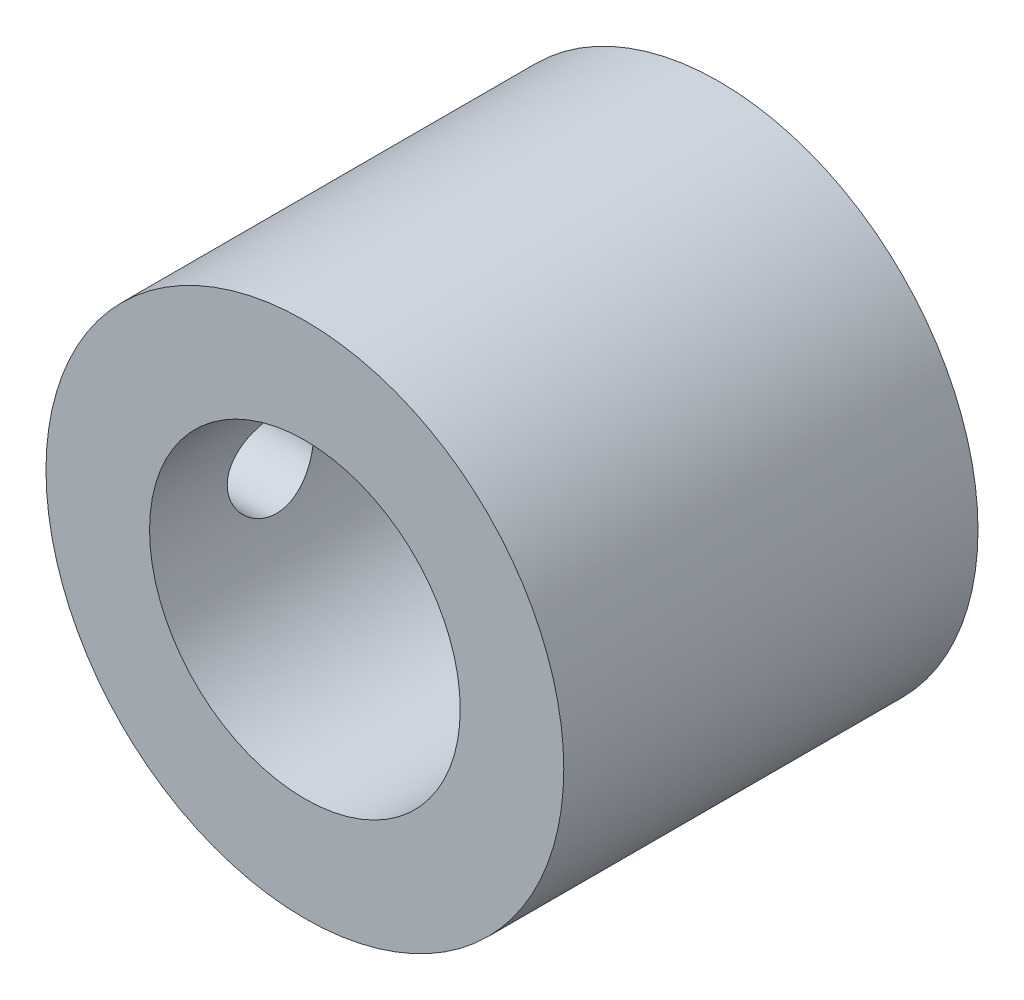
ISO-10303-21;
HEADER;
FILE_DESCRIPTION(('STEP AP214'),'2;1');
FILE_NAME('part.step','',(''),(''),'','','');
FILE_SCHEMA(('AUTOMOTIVE_DESIGN { 1 0 10303 214 1 1 1 1 }'));
ENDSEC;
DATA;
#1=APPLICATION_CONTEXT('core data for automotive mechanical design processes');
#2=APPLICATION_PROTOCOL_DEFINITION('international standard','automotive_design',2000,#1);
#3=PRODUCT_CONTEXT('',#1,'mechanical');
#4=PRODUCT('Part','Part','',(#3));
#5=PRODUCT_RELATED_PRODUCT_CATEGORY('part','',(#4));
#6=PRODUCT_DEFINITION_FORMATION('','',#4);
#7=PRODUCT_DEFINITION_CONTEXT('part definition',#1,'design');
#8=PRODUCT_DEFINITION('design','',#6,#7);
#9=PRODUCT_DEFINITION_SHAPE('','',#8);
#10=(LENGTH_UNIT() NAMED_UNIT(*) SI_UNIT(.MILLI.,.METRE.));
#11=(NAMED_UNIT(*) PLANE_ANGLE_UNIT() SI_UNIT($,.RADIAN.));
#12=(NAMED_UNIT(*) SI_UNIT($,.STERADIAN.) SOLID_ANGLE_UNIT());
#13=UNCERTAINTY_MEASURE_WITH_UNIT(LENGTH_MEASURE(1.E-05),#10,'distance_accuracy_value','');
#14=(GEOMETRIC_REPRESENTATION_CONTEXT(3) GLOBAL_UNCERTAINTY_ASSIGNED_CONTEXT((#13)) GLOBAL_UNIT_ASSIGNED_CONTEXT((#10,
#11,#12)) REPRESENTATION_CONTEXT('',''));
#15=CARTESIAN_POINT('',(0.,0.,0.));
#16=DIRECTION('',(0.,0.,1.));
#17=DIRECTION('',(1.,0.,0.));
#18=AXIS2_PLACEMENT_3D('',#15,#16,#17);
#19=CARTESIAN_POINT('',(0.,0.,6.));
#20=DIRECTION('',(0.,0.,1.));
#21=DIRECTION('',(1.,0.,0.));
#22=AXIS2_PLACEMENT_3D('',#19,#20,#21);
#23=PLANE('',#22);
#24=CARTESIAN_POINT('',(0.,0.,6.));
#25=DIRECTION('',(0.,0.,1.));
#26=DIRECTION('',(1.,0.,0.));
#27=AXIS2_PLACEMENT_3D('',#24,#25,#26);
#28=CIRCLE('',#27,7.5);
#29=CARTESIAN_POINT('',(7.5,0.,6.));
#30=VERTEX_POINT('',#29);
#31=EDGE_CURVE('E13',#30,#30,#28,.T.);
#32=ORIENTED_EDGE('',*,*,#31,.T.);
#33=EDGE_LOOP('',(#32));
#34=FACE_BOUND('',#33,.T.);
#35=CARTESIAN_POINT('',(0.,0.,6.));
#36=DIRECTION('',(0.,0.,1.));
#37=DIRECTION('',(1.,0.,0.));
#38=AXIS2_PLACEMENT_3D('',#35,#36,#37);
#39=CIRCLE('',#38,4.5);
#40=CARTESIAN_POINT('',(4.5,0.,6.));
#41=VERTEX_POINT('',#40);
#42=EDGE_CURVE('E66',#41,#41,#39,.T.);
#43=ORIENTED_EDGE('',*,*,#42,.F.);
#44=EDGE_LOOP('',(#43));
#45=FACE_BOUND('',#44,.T.);
#46=ADVANCED_FACE('F49',(#34,#45),#23,.T.);
#47=CARTESIAN_POINT('',(0.,0.,-6.));
#48=DIRECTION('',(0.,0.,1.));
#49=DIRECTION('',(1.,0.,0.));
#50=AXIS2_PLACEMENT_3D('',#47,#48,#49);
#51=PLANE('',#50);
#52=CARTESIAN_POINT('',(0.,0.,-6.));
#53=DIRECTION('',(0.,0.,1.));
#54=DIRECTION('',(1.,0.,0.));
#55=AXIS2_PLACEMENT_3D('',#52,#53,#54);
#56=CIRCLE('',#55,7.5);
#57=CARTESIAN_POINT('',(7.5,0.,-6.));
#58=VERTEX_POINT('',#57);
#59=EDGE_CURVE('E61',#58,#58,#56,.T.);
#60=ORIENTED_EDGE('',*,*,#59,.F.);
#61=EDGE_LOOP('',(#60));
#62=FACE_BOUND('',#61,.T.);
#63=CARTESIAN_POINT('',(0.,0.,-6.));
#64=DIRECTION('',(0.,0.,1.));
#65=DIRECTION('',(1.,0.,0.));
#66=AXIS2_PLACEMENT_3D('',#63,#64,#65);
#67=CIRCLE('',#66,4.5);
#68=CARTESIAN_POINT('',(4.5,0.,-6.));
#69=VERTEX_POINT('',#68);
#70=EDGE_CURVE('E69',#69,#69,#67,.T.);
#71=ORIENTED_EDGE('',*,*,#70,.T.);
#72=EDGE_LOOP('',(#71));
#73=FACE_BOUND('',#72,.T.);
#74=ADVANCED_FACE('F90',(#62,#73),#51,.F.);
#75=CARTESIAN_POINT('',(0.,0.,6.));
#76=DIRECTION('',(0.,0.,-1.));
#77=DIRECTION('',(-1.,0.,0.));
#78=AXIS2_PLACEMENT_3D('',#75,#76,#77);
#79=CYLINDRICAL_SURFACE('',#78,7.5);
#80=CARTESIAN_POINT('',(-7.49853668539317,-0.14814714918886,1.25881007811569));
#81=CARTESIAN_POINT('',(-7.49989853631527,-0.0791560083312159,1.25057810471537));
#82=CARTESIAN_POINT('',(-7.50031505587017,-0.00942177902208593,1.24810549323251));
#83=CARTESIAN_POINT('',(-7.49920421059306,0.129512539595059,1.25478052866052));
#84=CARTESIAN_POINT('',(-7.49767519644305,0.198712125603362,1.26393803494238));
#85=CARTESIAN_POINT('',(-7.49284368157634,0.334526816328075,1.29359267465974));
#86=CARTESIAN_POINT('',(-7.48954233942547,0.401143578960593,1.31408240051917));
#87=CARTESIAN_POINT('',(-7.48153055820797,0.529972038421318,1.36578318379207));
#88=CARTESIAN_POINT('',(-7.47682026988841,0.592184205629217,1.3969930942762));
#89=CARTESIAN_POINT('',(-7.466469674975,0.710922021615492,1.46948531597497));
#90=CARTESIAN_POINT('',(-7.46082336437785,0.767406895874267,1.51083353671277));
#91=CARTESIAN_POINT('',(-7.44924344897664,0.872686889516302,1.60234575764088));
#92=CARTESIAN_POINT('',(-7.44330981866186,0.921481324433156,1.6525105416857));
#93=CARTESIAN_POINT('',(-7.43175006405126,1.01051086271012,1.76085569456664));
#94=CARTESIAN_POINT('',(-7.42612776959387,1.05065189376501,1.81911383769646));
#95=CARTESIAN_POINT('',(-7.41589908047964,1.12057793883909,1.94162791075091));
#96=CARTESIAN_POINT('',(-7.41129265591147,1.1503632577874,2.00588366400222));
#97=CARTESIAN_POINT('',(-7.40364601785361,1.19859226935071,2.13830793436233));
#98=CARTESIAN_POINT('',(-7.40059939277215,1.21708245247847,2.20645913260562));
#99=CARTESIAN_POINT('',(-7.39640129719842,1.24234239760566,2.34495485896255));
#100=CARTESIAN_POINT('',(-7.39524965533037,1.24911321946675,2.41529918815061));
#101=CARTESIAN_POINT('',(-7.39497910645682,1.25071341250152,2.55524629993899));
#102=CARTESIAN_POINT('',(-7.39583502192726,1.24569069005211,2.62484738677125));
#103=CARTESIAN_POINT('',(-7.39942791031101,1.2241665480827,2.76219941044504));
#104=CARTESIAN_POINT('',(-7.40216487726213,1.20766516494557,2.8299503531501));
#105=CARTESIAN_POINT('',(-7.40920177224581,1.16370953851227,2.9616189876862));
#106=CARTESIAN_POINT('',(-7.41349982294661,1.1362684472629,3.02554117679872));
#107=CARTESIAN_POINT('',(-7.42317649873183,1.07122690482284,3.14790003206117));
#108=CARTESIAN_POINT('',(-7.42855520641062,1.03362567701949,3.2063362784206));
#109=CARTESIAN_POINT('',(-7.4398672386066,0.94880064613355,3.31681392794748));
#110=CARTESIAN_POINT('',(-7.44580641732348,0.901467332944261,3.36877066623081));
#111=CARTESIAN_POINT('',(-7.45752250094151,0.79876416762551,3.46404488490956));
#112=CARTESIAN_POINT('',(-7.46329939841115,0.743393948167221,3.50736197021252));
#113=CARTESIAN_POINT('',(-7.47408554047254,0.625741276370583,3.58440019096128));
#114=CARTESIAN_POINT('',(-7.47908951005007,0.563415931437342,3.61805662603906));
#115=CARTESIAN_POINT('',(-7.48771908313337,0.43390073687505,3.67440045386681));
#116=CARTESIAN_POINT('',(-7.49134477389577,0.366711195511232,3.69708854103012));
#117=CARTESIAN_POINT('',(-7.49678178492105,0.229998667870182,3.73065479896459));
#118=CARTESIAN_POINT('',(-7.49860874773211,0.160501332467748,3.7416348588454));
#119=CARTESIAN_POINT('',(-7.50029761916577,0.0206278958099769,3.75179494821907));
#120=CARTESIAN_POINT('',(-7.50015966298173,-0.04974814465447,3.75097578953975));
#121=CARTESIAN_POINT('',(-7.49794631901423,-0.188615901301093,3.73763488461607));
#122=CARTESIAN_POINT('',(-7.4958908627297,-0.257119551137286,3.7252335282828));
#123=CARTESIAN_POINT('',(-7.49009810888207,-0.391058312883112,3.68927790399856));
#124=CARTESIAN_POINT('',(-7.486360768193,-0.456493346061425,3.66572335006252));
#125=CARTESIAN_POINT('',(-7.47759568597117,-0.58274066716334,3.6080384544945));
#126=CARTESIAN_POINT('',(-7.47256289012789,-0.643533610939384,3.57386657796721));
#127=CARTESIAN_POINT('',(-7.4617640439326,-0.758564470114103,3.49594524228205));
#128=CARTESIAN_POINT('',(-7.45599793371955,-0.812801849671066,3.452195001024));
#129=CARTESIAN_POINT('',(-7.44428976599884,-0.913879061952738,3.35572472549129));
#130=CARTESIAN_POINT('',(-7.43834642002964,-0.960620539144185,3.30290174183493));
#131=CARTESIAN_POINT('',(-7.42701957642658,-1.04459610620854,3.19011741584552));
#132=CARTESIAN_POINT('',(-7.42163608619201,-1.08183007043562,3.13015597919013));
#133=CARTESIAN_POINT('',(-7.41203355245485,-1.14577965144513,3.00463692736194));
#134=CARTESIAN_POINT('',(-7.40781661348047,-1.17247629481511,2.93906947388057));
#135=CARTESIAN_POINT('',(-7.40105201022339,-1.21444852498432,2.80429443753485));
#136=CARTESIAN_POINT('',(-7.39850420414997,-1.22972508192097,2.73508716440827));
#137=CARTESIAN_POINT('',(-7.39539752985773,-1.24827238945897,2.5958648121447));
#138=CARTESIAN_POINT('',(-7.39481571710875,-1.25168165399825,2.5258686867236));
#139=CARTESIAN_POINT('',(-7.39564451435093,-1.2467751004003,2.38630280747408));
#140=CARTESIAN_POINT('',(-7.39705504024682,-1.23845977715008,2.31673303577405));
#141=CARTESIAN_POINT('',(-7.40168765331035,-1.21046136143276,2.18048920125591));
#142=CARTESIAN_POINT('',(-7.40489717107789,-1.19085711796914,2.11379846765003));
#143=CARTESIAN_POINT('',(-7.41275410578575,-1.1409256004087,1.98465322287812));
#144=CARTESIAN_POINT('',(-7.41740156552521,-1.11059800713662,1.92219883787088));
#145=CARTESIAN_POINT('',(-7.42766108423013,-1.03977752704496,1.80269903834066));
#146=CARTESIAN_POINT('',(-7.43328115160966,-0.999198844796533,1.74570517517774));
#147=CARTESIAN_POINT('',(-7.4448333799776,-0.909127118530739,1.6392740763667));
#148=CARTESIAN_POINT('',(-7.45076562034998,-0.859631799228168,1.58983877542595));
#149=CARTESIAN_POINT('',(-7.46235208036947,-0.752485045576716,1.49938130326145));
#150=CARTESIAN_POINT('',(-7.46800246622444,-0.694748886673225,1.45845899970183));
#151=CARTESIAN_POINT('',(-7.47831370807879,-0.573175737626717,1.38692568417347));
#152=CARTESIAN_POINT('',(-7.48297549694989,-0.509344582169231,1.35630493517947));
#153=CARTESIAN_POINT('',(-7.48969405065416,-0.395919617287293,1.31326929726559));
#154=CARTESIAN_POINT('',(-7.49211473531624,-0.347351565993603,1.29815705238145));
#155=CARTESIAN_POINT('',(-7.49603784595619,-0.24870396899011,1.27393895461991));
#156=CARTESIAN_POINT('',(-7.4975402884857,-0.198624450542104,1.26483299347691));
#157=CARTESIAN_POINT('',(-7.49853668539317,-0.14814714918886,1.25881007811569));
#158=B_SPLINE_CURVE_WITH_KNOTS('',3,(#80,#81,#82,#83,#84,#85,#86,#87,#88,#89,#90,#91,#92,#93,
#94,#95,#96,#97,#98,#99,#100,#101,#102,#103,#104,#105,#106,#107,#108,#109,#110,#111,#112,#113,
#114,#115,#116,#117,#118,#119,#120,#121,#122,#123,#124,#125,#126,#127,#128,#129,#130,#131,#132,
#133,#134,#135,#136,#137,#138,#139,#140,#141,#142,#143,#144,#145,#146,#147,#148,#149,#150,#151,
#152,#153,#154,#155,#156,#157),.UNSPECIFIED.,.T.,.F.,(4,2,2,2,2,2,2,2,2,2,2,2,2,2,2,2,2,2,2,2,2,
2,2,2,2,2,2,2,2,2,2,2,2,2,2,2,2,2,4),(0.,0.208297041199928,0.416770783046075,0.625108411837705,
0.833423757976362,1.04313105078826,1.25285699749408,1.46475922286968,1.67665520814985,
1.88767305237462,2.09867181182122,2.30703853213844,2.51540459201762,2.72352089974916,
2.93165311981609,3.14226989288176,3.35289629527312,3.56490206196652,3.77689440467642,
3.98702643859664,4.19714401476147,4.40510156891225,4.613064455702,4.82185135892288,
5.03065531653883,5.24200746703393,5.45336241049291,5.6650962005413,5.8768120017395,
6.08604823411655,6.29527563503652,6.50305908439793,6.71084871885259,6.920438639751,
7.13008211829192,7.34206125649567,7.55383946544875,7.70624254099359,7.85864286933913),.UNSPECIFIED.);
#159=CARTESIAN_POINT('',(-7.49853668539317,-0.14814714918886,1.25881007811569));
#160=VERTEX_POINT('',#159);
#161=EDGE_CURVE('E54',#160,#160,#158,.T.);
#162=ORIENTED_EDGE('',*,*,#161,.T.);
#163=EDGE_LOOP('',(#162));
#164=FACE_BOUND('',#163,.T.);
#165=CARTESIAN_POINT('',(0.,-7.5,-1.25000000000001));
#166=CARTESIAN_POINT('',(0.0696954524791068,-7.49999880584411,-1.25000279447392));
#167=CARTESIAN_POINT('',(0.139428940919409,-7.49901838956517,-1.25584863748447));
#168=CARTESIAN_POINT('',(0.276940110836519,-7.49520172470693,-1.27906782938267));
#169=CARTESIAN_POINT('',(0.34471593397962,-7.49236376961945,-1.29645177845581));
#170=CARTESIAN_POINT('',(0.476302373606318,-7.48515034118225,-1.34220772429639));
#171=CARTESIAN_POINT('',(0.540116184215946,-7.48077612579596,-1.3705707328203));
#172=CARTESIAN_POINT('',(0.662070920988966,-7.47097113541035,-1.43745614602621));
#173=CARTESIAN_POINT('',(0.720212494939289,-7.46554048127217,-1.47597738874151));
#174=CARTESIAN_POINT('',(0.829736307145832,-7.45416658729156,-1.56247754191024));
#175=CARTESIAN_POINT('',(0.881056451767476,-7.44821935907428,-1.61053455731807));
#176=CARTESIAN_POINT('',(0.974944249329955,-7.43651313438366,-1.71457398423641));
#177=CARTESIAN_POINT('',(1.01751134969548,-7.43075414981334,-1.77055689572831));
#178=CARTESIAN_POINT('',(1.09293356280256,-7.4200378287989,-1.88928548309853));
#179=CARTESIAN_POINT('',(1.12572727643049,-7.41508564545818,-1.95207066840238));
#180=CARTESIAN_POINT('',(1.1802791827056,-7.40659894897337,-2.08235478215032));
#181=CARTESIAN_POINT('',(1.2020381207828,-7.40306434007154,-2.14985339183882));
#182=CARTESIAN_POINT('',(1.23370718889239,-7.39785268421377,-2.28699013742827));
#183=CARTESIAN_POINT('',(1.24372451456769,-7.3961588424285,-2.3566028682507));
#184=CARTESIAN_POINT('',(1.25195836264493,-7.39476969468325,-2.49654013844174));
#185=CARTESIAN_POINT('',(1.25017572019449,-7.39507424728607,-2.56686462708365));
#186=CARTESIAN_POINT('',(1.23494754919806,-7.39763214431777,-2.70546393063772));
#187=CARTESIAN_POINT('',(1.22162244094488,-7.39986536659458,-2.77375240177261));
#188=CARTESIAN_POINT('',(1.18387657020171,-7.40599747605504,-2.90711065891456));
#189=CARTESIAN_POINT('',(1.15945542715986,-7.40989642036636,-2.97218033444427));
#190=CARTESIAN_POINT('',(1.10008862304695,-7.4189423966705,-3.09761441172045));
#191=CARTESIAN_POINT('',(1.06509295693985,-7.42409533553663,-3.15795470304061));
#192=CARTESIAN_POINT('',(0.985606008778708,-7.43506459207504,-3.27195220026919));
#193=CARTESIAN_POINT('',(0.941113960327134,-7.44088096327143,-3.32560886622746));
#194=CARTESIAN_POINT('',(0.843241106079518,-7.45261013939893,-3.42541304290367));
#195=CARTESIAN_POINT('',(0.789756981936556,-7.45852324615826,-3.47145925927003));
#196=CARTESIAN_POINT('',(0.675767624490817,-7.46971300698361,-3.55393888133266));
#197=CARTESIAN_POINT('',(0.615262345953205,-7.47498965694872,-3.5903722250916));
#198=CARTESIAN_POINT('',(0.48885295808335,-7.48431946446455,-3.65260111356813));
#199=CARTESIAN_POINT('',(0.422944362782326,-7.48837159203723,-3.67838770966562));
#200=CARTESIAN_POINT('',(0.287649172801363,-7.49478751506329,-3.71849710762298));
#201=CARTESIAN_POINT('',(0.218262869589732,-7.49715145175236,-3.73282086848685));
#202=CARTESIAN_POINT('',(0.0788549506508103,-7.49990564921343,-3.74946067923056));
#203=CARTESIAN_POINT('',(0.00885036857550463,-7.50031876506392,-3.75191578590279));
#204=CARTESIAN_POINT('',(-0.130569886444943,-7.49918737210585,-3.74511932778593));
#205=CARTESIAN_POINT('',(-0.199985581946018,-7.49764293862059,-3.73586821343312));
#206=CARTESIAN_POINT('',(-0.335828087773379,-7.49278413469101,-3.70603757533225));
#207=CARTESIAN_POINT('',(-0.402270434192687,-7.48948052400655,-3.68552689580493));
#208=CARTESIAN_POINT('',(-0.530773442430217,-7.48147232227679,-3.63383274090022));
#209=CARTESIAN_POINT('',(-0.592833857954854,-7.4767676525601,-3.60264866618235));
#210=CARTESIAN_POINT('',(-0.711415344734473,-7.46642258151204,-3.5301744376516));
#211=CARTESIAN_POINT('',(-0.767882625468568,-7.46077427943511,-3.48879742191636));
#212=CARTESIAN_POINT('',(-0.873121792751337,-7.4491923369595,-3.39723134230746));
#213=CARTESIAN_POINT('',(-0.921893119848283,-7.44325867585773,-3.34704163836166));
#214=CARTESIAN_POINT('',(-1.01087138982899,-7.43170087617923,-3.23865122596428));
#215=CARTESIAN_POINT('',(-1.05098438055685,-7.42608058068553,-3.18037291724279));
#216=CARTESIAN_POINT('',(-1.12085115514748,-7.41585764888942,-3.05782351543073));
#217=CARTESIAN_POINT('',(-1.1506052673849,-7.4112549803301,-2.99355261238625));
#218=CARTESIAN_POINT('',(-1.19876916573656,-7.40361726848852,-2.86110513359393));
#219=CARTESIAN_POINT('',(-1.21722571627396,-7.40057577155532,-2.79294595248475));
#220=CARTESIAN_POINT('',(-1.24241772688913,-7.3963885841763,-2.65443993538912));
#221=CARTESIAN_POINT('',(-1.24915420597307,-7.39524272891361,-2.58409329013397));
#222=CARTESIAN_POINT('',(-1.25068643302366,-7.39498366542006,-2.4441474170188));
#223=CARTESIAN_POINT('',(-1.24563006806258,-7.39584528252825,-2.37454981071236));
#224=CARTESIAN_POINT('',(-1.22403991947841,-7.39944890726864,-2.23721037597462));
#225=CARTESIAN_POINT('',(-1.20750617305623,-7.40219090880607,-2.16946854152907));
#226=CARTESIAN_POINT('',(-1.16348724479744,-7.40923678140859,-2.0378207813537));
#227=CARTESIAN_POINT('',(-1.13601479530021,-7.41353883609835,-1.97391049497199));
#228=CARTESIAN_POINT('',(-1.07091350195794,-7.42322184461104,-1.85158216540258));
#229=CARTESIAN_POINT('',(-1.03328415437427,-7.428602851942,-1.79316439481394));
#230=CARTESIAN_POINT('',(-0.948409442186068,-7.43991727022811,-1.68273220844613));
#231=CARTESIAN_POINT('',(-0.901055281796815,-7.44585647788151,-1.63080199164987));
#232=CARTESIAN_POINT('',(-0.798304515690108,-7.4575718618042,-1.53557419776254));
#233=CARTESIAN_POINT('',(-0.74290605645631,-7.46334800013273,-1.49227861568092));
#234=CARTESIAN_POINT('',(-0.625184584820134,-7.4741326482111,-1.41527586590004));
#235=CARTESIAN_POINT('',(-0.562816393766403,-7.47913558126552,-1.38163698034353));
#236=CARTESIAN_POINT('',(-0.433256534689486,-7.48775583800888,-1.32536525769505));
#237=CARTESIAN_POINT('',(-0.366069747415,-7.4913745408874,-1.30272145946016));
#238=CARTESIAN_POINT('',(-0.248851655022697,-7.49602895416477,-1.27399736293668));
#239=CARTESIAN_POINT('',(-0.199529415149221,-7.49751013636679,-1.26501276519203));
#240=CARTESIAN_POINT('',(-0.100144655159903,-7.4994960799306,-1.25301313107763));
#241=CARTESIAN_POINT('',(-0.0500821478042465,-7.50000085810321,-1.24999799193133));
#242=CARTESIAN_POINT('',(0.,-7.5,-1.25000000000001));
#243=B_SPLINE_CURVE_WITH_KNOTS('',3,(#165,#166,#167,#168,#169,#170,#171,#172,#173,#174,#175,
#176,#177,#178,#179,#180,#181,#182,#183,#184,#185,#186,#187,#188,#189,#190,#191,#192,#193,#194,
#195,#196,#197,#198,#199,#200,#201,#202,#203,#204,#205,#206,#207,#208,#209,#210,#211,#212,#213,
#214,#215,#216,#217,#218,#219,#220,#221,#222,#223,#224,#225,#226,#227,#228,#229,#230,#231,#232,
#233,#234,#235,#236,#237,#238,#239,#240,#241,#242),.UNSPECIFIED.,.T.,.F.,(4,2,2,2,2,2,2,2,2,2,2,
2,2,2,2,2,2,2,2,2,2,2,2,2,2,2,2,2,2,2,2,2,2,2,2,2,2,2,4),(0.,0.208903292469253,
0.417998772847706,0.626923433512629,0.835824206337388,1.04651245531165,1.25721400084927,
1.46921260411919,1.68119688438089,1.8912303855171,2.10124902160441,2.30910260880202,
2.51696332512688,2.72582278316276,2.93469910340284,3.1461638495566,3.35762995817921,
3.56927344457948,3.78089922260571,3.99003941745695,4.19917156517926,4.40703903503204,
4.61491817913029,4.82463412813507,5.03436531527137,5.24626911003805,5.45816618687966,
5.66918011170881,5.88017568893304,6.08853954761345,6.29690273094061,6.50502409113105,
6.71315577514662,6.9237569209669,7.1344066693948,7.34651115803593,7.55840376065029,
7.70852124082002,7.85863613638477),.UNSPECIFIED.);
#244=CARTESIAN_POINT('',(0.,-7.5,-1.25000000000001));
#245=VERTEX_POINT('',#244);
#246=EDGE_CURVE('E77',#245,#245,#243,.T.);
#247=ORIENTED_EDGE('',*,*,#246,.T.);
#248=EDGE_LOOP('',(#247));
#249=FACE_BOUND('',#248,.T.);
#250=ORIENTED_EDGE('',*,*,#31,.F.);
#251=EDGE_LOOP('',(#250));
#252=FACE_BOUND('',#251,.T.);
#253=ORIENTED_EDGE('',*,*,#59,.T.);
#254=EDGE_LOOP('',(#253));
#255=FACE_BOUND('',#254,.T.);
#256=ADVANCED_FACE('F84',(#164,#249,#252,#255),#79,.T.);
#257=CARTESIAN_POINT('',(0.,0.,6.));
#258=DIRECTION('',(0.,0.,-1.));
#259=DIRECTION('',(-1.,0.,0.));
#260=AXIS2_PLACEMENT_3D('',#257,#258,#259);
#261=CYLINDRICAL_SURFACE('',#260,4.5);
#262=CARTESIAN_POINT('',(-4.49648213642878,-0.17789996283529,1.26272412000267));
#263=CARTESIAN_POINT('',(-4.49915001564048,-0.110449866883669,1.25302693938055));
#264=CARTESIAN_POINT('',(-4.50031911383067,-0.0421354135383501,1.24885057807801));
#265=CARTESIAN_POINT('',(-4.49952999089651,0.094251564721635,1.25169269945791));
#266=CARTESIAN_POINT('',(-4.49757110340119,0.162324034988951,1.25871356754364));
#267=CARTESIAN_POINT('',(-4.49074020538497,0.296216929192495,1.28369814587152));
#268=CARTESIAN_POINT('',(-4.48587047586989,0.362039073885382,1.30165328796042));
#269=CARTESIAN_POINT('',(-4.473735650407,0.489699186061549,1.34791229752246));
#270=CARTESIAN_POINT('',(-4.46647031595234,0.551536756106777,1.37621719544969));
#271=CARTESIAN_POINT('',(-4.45017130783353,0.670552881111224,1.44284310074528));
#272=CARTESIAN_POINT('',(-4.44111240588701,0.727646213282195,1.4813099797271));
#273=CARTESIAN_POINT('',(-4.42224400007722,0.834696010229894,1.56700183376002));
#274=CARTESIAN_POINT('',(-4.41243434845848,0.884651064542775,1.61422853545387));
#275=CARTESIAN_POINT('',(-4.39279069704915,0.977609457279786,1.71784155173753));
#276=CARTESIAN_POINT('',(-4.38296537924145,1.02034911876817,1.7744665329658));
#277=CARTESIAN_POINT('',(-4.36473159136692,1.09573162448292,1.89429258421115));
#278=CARTESIAN_POINT('',(-4.35632307984443,1.12837476415635,1.95749346173031));
#279=CARTESIAN_POINT('',(-4.34196910980397,1.18240712762228,2.08841681374387));
#280=CARTESIAN_POINT('',(-4.3360109408063,1.20385458625726,2.15611378339931));
#281=CARTESIAN_POINT('',(-4.32724422529544,1.23499964257416,2.29435000094675));
#282=CARTESIAN_POINT('',(-4.32443478064794,1.24470059086505,2.36488843239718));
#283=CARTESIAN_POINT('',(-4.32236553886299,1.25186592070586,2.50410798055389));
#284=CARTESIAN_POINT('',(-4.32298287247087,1.24975384446063,2.57276576110983));
#285=CARTESIAN_POINT('',(-4.32740591316268,1.23435039626086,2.70870558957721));
#286=CARTESIAN_POINT('',(-4.33121151897193,1.22105937940253,2.77598768111752));
#287=CARTESIAN_POINT('',(-4.34150413397757,1.18393611446047,2.90665209310204));
#288=CARTESIAN_POINT('',(-4.34796531339363,1.16020525851348,2.97006540152935));
#289=CARTESIAN_POINT('',(-4.36283877807253,1.10295449764474,3.09205884675645));
#290=CARTESIAN_POINT('',(-4.37125141008171,1.06943285275967,3.15063812210412));
#291=CARTESIAN_POINT('',(-4.38941153492507,0.992310583134012,3.26329910858681));
#292=CARTESIAN_POINT('',(-4.39919278511306,0.948425171154819,3.31718044391219));
#293=CARTESIAN_POINT('',(-4.41881157344058,0.852352197557784,3.41694782953563));
#294=CARTESIAN_POINT('',(-4.42864912080296,0.800163235766879,3.46283252867434));
#295=CARTESIAN_POINT('',(-4.44755503701491,0.687452743163981,3.54639651966282));
#296=CARTESIAN_POINT('',(-4.456599379142,0.626761761562104,3.58385329070815));
#297=CARTESIAN_POINT('',(-4.47262973683677,0.499678382140245,3.64799182113299));
#298=CARTESIAN_POINT('',(-4.47961604806986,0.433286805063541,3.67467512847811));
#299=CARTESIAN_POINT('',(-4.4906254813696,0.297991992040864,3.71598025472675));
#300=CARTESIAN_POINT('',(-4.49470209846984,0.229159916769896,3.73082044827405));
#301=CARTESIAN_POINT('',(-4.49964155384873,0.0898734140678445,3.74873953986727));
#302=CARTESIAN_POINT('',(-4.50050507446979,0.0194193342883428,3.75182093504896));
#303=CARTESIAN_POINT('',(-4.49894658114062,-0.118789115473181,3.74620433421995));
#304=CARTESIAN_POINT('',(-4.49662523826874,-0.186559650268711,3.73786728085751));
#305=CARTESIAN_POINT('',(-4.48912522436011,-0.319689916491703,3.71033846543766));
#306=CARTESIAN_POINT('',(-4.48394649261418,-0.385049596665751,3.69114647275186));
#307=CARTESIAN_POINT('',(-4.47125588862219,-0.511806236005536,3.64244511006411));
#308=CARTESIAN_POINT('',(-4.46373622059715,-0.573189114017367,3.61290122432568));
#309=CARTESIAN_POINT('',(-4.44714644203817,-0.690207171906032,3.5443724777153));
#310=CARTESIAN_POINT('',(-4.43807603034507,-0.745841231971492,3.50538578240701));
#311=CARTESIAN_POINT('',(-4.41900085786046,-0.851716964196132,3.41758396344293));
#312=CARTESIAN_POINT('',(-4.40897527530495,-0.901723675345948,3.3684898313762));
#313=CARTESIAN_POINT('',(-4.38934490328083,-0.992890279258532,3.26259507236644));
#314=CARTESIAN_POINT('',(-4.37974016786872,-1.03404903816647,3.20579345923822));
#315=CARTESIAN_POINT('',(-4.3619005478113,-1.10691290560461,3.08505236781492));
#316=CARTESIAN_POINT('',(-4.35368769386987,-1.1384713237345,3.02102083918762));
#317=CARTESIAN_POINT('',(-4.33980610957949,-1.19029777125044,2.88828356727871));
#318=CARTESIAN_POINT('',(-4.33413677487214,-1.21056848295281,2.81957893883184));
#319=CARTESIAN_POINT('',(-4.32617826809811,-1.23870557366509,2.68148048385005));
#320=CARTESIAN_POINT('',(-4.32379943815259,-1.24690138778097,2.61215901897749));
#321=CARTESIAN_POINT('',(-4.32242908367377,-1.25164466511206,2.47309133096069));
#322=CARTESIAN_POINT('',(-4.32343697827991,-1.2481941258047,2.40334518270241));
#323=CARTESIAN_POINT('',(-4.32863734154807,-1.23003311597763,2.26742349834185));
#324=CARTESIAN_POINT('',(-4.33274162361469,-1.21563436797066,2.20120250367819));
#325=CARTESIAN_POINT('',(-4.34354937527104,-1.17643053734907,2.07214387250944));
#326=CARTESIAN_POINT('',(-4.35025309865963,-1.15162443858372,2.00930656705646));
#327=CARTESIAN_POINT('',(-4.36563989026273,-1.09185712393381,1.88761058624694));
#328=CARTESIAN_POINT('',(-4.37435415759385,-1.05673316319348,1.82883592600381));
#329=CARTESIAN_POINT('',(-4.39274558470603,-0.977464985095423,1.71787886641858));
#330=CARTESIAN_POINT('',(-4.40242301486895,-0.933318231148065,1.66569832758102));
#331=CARTESIAN_POINT('',(-4.42205970928668,-0.835440446620297,1.56752542269918));
#332=CARTESIAN_POINT('',(-4.43201707299456,-0.781429536074321,1.52181131229849));
#333=CARTESIAN_POINT('',(-4.45077132333198,-0.666351633521661,1.44006953336661));
#334=CARTESIAN_POINT('',(-4.45956862088917,-0.605287154541712,1.40403843012558));
#335=CARTESIAN_POINT('',(-4.47422840853807,-0.48435250543587,1.34590851884146));
#336=CARTESIAN_POINT('',(-4.48030049233707,-0.425013685089956,1.32275322743189));
#337=CARTESIAN_POINT('',(-4.49017932823261,-0.303334988183685,1.28569743987664));
#338=CARTESIAN_POINT('',(-4.49398648861253,-0.24099565469813,1.27179527567471));
#339=CARTESIAN_POINT('',(-4.49648213642878,-0.17789996283529,1.26272412000267));
#340=B_SPLINE_CURVE_WITH_KNOTS('',3,(#262,#263,#264,#265,#266,#267,#268,#269,#270,#271,#272,
#273,#274,#275,#276,#277,#278,#279,#280,#281,#282,#283,#284,#285,#286,#287,#288,#289,#290,#291,
#292,#293,#294,#295,#296,#297,#298,#299,#300,#301,#302,#303,#304,#305,#306,#307,#308,#309,#310,
#311,#312,#313,#314,#315,#316,#317,#318,#319,#320,#321,#322,#323,#324,#325,#326,#327,#328,#329,
#330,#331,#332,#333,#334,#335,#336,#337,#338,#339),.UNSPECIFIED.,.T.,.F.,(4,2,2,2,2,2,2,2,2,2,2,
2,2,2,2,2,2,2,2,2,2,2,2,2,2,2,2,2,2,2,2,2,2,2,2,2,2,2,4),(0.,0.204359577618887,
0.408762696823836,0.613005850428436,0.817269344660261,1.02464135468968,1.23205428319712,
1.44590045781319,1.65974037421466,1.87245662152139,2.08511217871937,2.29019323765787,
2.49526778249447,2.69839315160276,2.9015546409834,3.11113003277021,3.32074080140542,
3.53536533424843,3.7499590181709,3.96049796761022,4.17099220384032,4.37498395530617,
4.57898004102548,4.78366287545829,4.98838550516768,5.19978308013034,5.41120772931945,
5.62571706919003,5.84017541307505,6.04866685759723,6.25712254536591,6.45985544337391,
6.66260814038237,6.86874838513778,7.07494666228156,7.28831464386077,7.50160684037491,
7.69280796823319,7.88397461902506),.UNSPECIFIED.);
#341=CARTESIAN_POINT('',(-4.49648213642878,-0.17789996283529,1.26272412000267));
#342=VERTEX_POINT('',#341);
#343=EDGE_CURVE('E71',#342,#342,#340,.T.);
#344=ORIENTED_EDGE('',*,*,#343,.F.);
#345=EDGE_LOOP('',(#344));
#346=FACE_BOUND('',#345,.T.);
#347=CARTESIAN_POINT('',(0.,-4.5,-1.25000000000001));
#348=CARTESIAN_POINT('',(0.0688012508831786,-4.49999908016929,-1.25000139958524));
#349=CARTESIAN_POINT('',(0.137617123752666,-4.49840674086832,-1.2556993198053));
#350=CARTESIAN_POINT('',(0.273259475994236,-4.49220950198236,-1.27829572826533));
#351=CARTESIAN_POINT('',(0.340085103663436,-4.48760333149253,-1.29519894171373));
#352=CARTESIAN_POINT('',(0.469769949680298,-4.47588565394594,-1.33960871941393));
#353=CARTESIAN_POINT('',(0.532634390095665,-4.46877753030963,-1.36710096869842));
#354=CARTESIAN_POINT('',(0.652860695241766,-4.45280312581995,-1.43185350632688));
#355=CARTESIAN_POINT('',(0.710222070812291,-4.44393668888688,-1.46911466191926));
#356=CARTESIAN_POINT('',(0.819246784715917,-4.4251515781749,-1.55332943384287));
#357=CARTESIAN_POINT('',(0.870753112808466,-4.41521373623695,-1.60048203968755));
#358=CARTESIAN_POINT('',(0.96523818569633,-4.39552607117256,-1.7027162771216));
#359=CARTESIAN_POINT('',(1.00821573084553,-4.38577627467017,-1.75779902227524));
#360=CARTESIAN_POINT('',(1.08520808580323,-4.36737044294547,-1.87560726012932));
#361=CARTESIAN_POINT('',(1.11903874947836,-4.35873847945984,-1.93845720844372));
#362=CARTESIAN_POINT('',(1.17558957131139,-4.34382900808304,-2.06923191764012));
#363=CARTESIAN_POINT('',(1.19831197336241,-4.33755102474248,-2.13715565040816));
#364=CARTESIAN_POINT('',(1.23144924367955,-4.32825883142877,-2.27440278885413));
#365=CARTESIAN_POINT('',(1.24215036904295,-4.32516886003198,-2.34365182163988));
#366=CARTESIAN_POINT('',(1.25183427077971,-4.32237649384804,-2.48302588556283));
#367=CARTESIAN_POINT('',(1.25081944027302,-4.3226734072502,-2.5531507348812));
#368=CARTESIAN_POINT('',(1.23732671337619,-4.32655366801453,-2.6900222787227));
#369=CARTESIAN_POINT('',(1.2251990227067,-4.33003660668585,-2.75680680149621));
#370=CARTESIAN_POINT('',(1.19038731201904,-4.33973517053475,-2.88735362859159));
#371=CARTESIAN_POINT('',(1.16770238457157,-4.3459510306134,-2.95111567260225));
#372=CARTESIAN_POINT('',(1.11214373134464,-4.36050069775752,-3.07470223145528));
#373=CARTESIAN_POINT('',(1.0791502183699,-4.36885918600197,-3.13446986681005));
#374=CARTESIAN_POINT('',(1.00399440679635,-4.386739506843,-3.24774157559124));
#375=CARTESIAN_POINT('',(0.961830166290593,-4.39626158564315,-3.30124431872613));
#376=CARTESIAN_POINT('',(0.867755610284433,-4.41581072126827,-3.40246388043641));
#377=CARTESIAN_POINT('',(0.815552279702348,-4.42584370037791,-3.44990763487984));
#378=CARTESIAN_POINT('',(0.703806607201029,-4.44498199810828,-3.5354257307778));
#379=CARTESIAN_POINT('',(0.644263925421959,-4.45408727373461,-3.57349963810247));
#380=CARTESIAN_POINT('',(0.519083429338109,-4.47040839712755,-3.63933181563006));
#381=CARTESIAN_POINT('',(0.453416395747743,-4.47761448645531,-3.66703710393889));
#382=CARTESIAN_POINT('',(0.318109988769711,-4.48925492501446,-3.71093409844136));
#383=CARTESIAN_POINT('',(0.248471564121128,-4.49368993323699,-3.72712854215656));
#384=CARTESIAN_POINT('',(0.10952660771314,-4.49918736483408,-3.74710713677896));
#385=CARTESIAN_POINT('',(0.0402773058586798,-4.5003505382403,-3.75126214490716));
#386=CARTESIAN_POINT('',(-0.0979299306365675,-4.49946480293159,-3.74807300170756));
#387=CARTESIAN_POINT('',(-0.166887897284518,-4.49741625678167,-3.74073014835194));
#388=CARTESIAN_POINT('',(-0.301206913470859,-4.49040265059028,-3.71505666588035));
#389=CARTESIAN_POINT('',(-0.366611288163865,-4.4854933716758,-3.69693605494247));
#390=CARTESIAN_POINT('',(-0.493443118118718,-4.47331829169354,-3.65046813236189));
#391=CARTESIAN_POINT('',(-0.554870123972378,-4.46605222488463,-3.62211966743048));
#392=CARTESIAN_POINT('',(-0.673420140405411,-4.44973740284174,-3.5553341219535));
#393=CARTESIAN_POINT('',(-0.730427061953536,-4.44065471340565,-3.51669947567732));
#394=CARTESIAN_POINT('',(-0.837277670586994,-4.42175477128212,-3.43068386419253));
#395=CARTESIAN_POINT('',(-0.887119814631369,-4.41193736105189,-3.38330101993423));
#396=CARTESIAN_POINT('',(-0.979812026944944,-4.39229842684379,-3.27939855612164));
#397=CARTESIAN_POINT('',(-1.02239957885382,-4.3824860820796,-3.22264254844242));
#398=CARTESIAN_POINT('',(-1.09745581429007,-4.36429693304267,-3.10257936212026));
#399=CARTESIAN_POINT('',(-1.12992488482462,-4.35592007387163,-3.0392724341574));
#400=CARTESIAN_POINT('',(-1.18358105834152,-4.34164798956173,-2.90819283011682));
#401=CARTESIAN_POINT('',(-1.20483077484782,-4.3357390309604,-2.84044736224536));
#402=CARTESIAN_POINT('',(-1.23557652495356,-4.32707876892783,-2.70215029058323));
#403=CARTESIAN_POINT('',(-1.24507587906572,-4.32432657344887,-2.63159948536688));
#404=CARTESIAN_POINT('',(-1.2518485997432,-4.32237038329875,-2.49239422050922));
#405=CARTESIAN_POINT('',(-1.24954571014581,-4.32304340461176,-2.42376180998806));
#406=CARTESIAN_POINT('',(-1.23377143287257,-4.32757137052123,-2.28790510620532));
#407=CARTESIAN_POINT('',(-1.22030038049409,-4.33142621959091,-2.22068077073177));
#408=CARTESIAN_POINT('',(-1.18282724248613,-4.34180718808003,-2.09013276608194));
#409=CARTESIAN_POINT('',(-1.15892214641116,-4.34830866913275,-2.02677915735225));
#410=CARTESIAN_POINT('',(-1.10133451670733,-4.36324916052054,-1.90493257749268));
#411=CARTESIAN_POINT('',(-1.06765033358687,-4.37168849767404,-1.84644042851432));
#412=CARTESIAN_POINT('',(-0.990206962020962,-4.38988810785379,-1.73397234717483));
#413=CARTESIAN_POINT('',(-0.946162084346257,-4.39968178982262,-1.68019852331728));
#414=CARTESIAN_POINT('',(-0.849781527450654,-4.41930831909362,-1.58066762794655));
#415=CARTESIAN_POINT('',(-0.797443795628183,-4.4291411755031,-1.53491254710902));
#416=CARTESIAN_POINT('',(-0.684460232307874,-4.44801839581548,-1.45164186342193));
#417=CARTESIAN_POINT('',(-0.623646258932167,-4.45703841192791,-1.41434837668933));
#418=CARTESIAN_POINT('',(-0.496361982692835,-4.47299974900605,-1.35057186071053));
#419=CARTESIAN_POINT('',(-0.429895030176719,-4.47994229035335,-1.32408248141899));
#420=CARTESIAN_POINT('',(-0.303145483766696,-4.4901607483195,-1.28577991926531));
#421=CARTESIAN_POINT('',(-0.243364402168738,-4.49382245661855,-1.27239521240714));
#422=CARTESIAN_POINT('',(-0.122392625693408,-4.49874234976284,-1.25450515417747));
#423=CARTESIAN_POINT('',(-0.0612020980194145,-4.50000081823467,-1.24999875500008));
#424=CARTESIAN_POINT('',(0.,-4.5,-1.25000000000001));
#425=B_SPLINE_CURVE_WITH_KNOTS('',3,(#347,#348,#349,#350,#351,#352,#353,#354,#355,#356,#357,
#358,#359,#360,#361,#362,#363,#364,#365,#366,#367,#368,#369,#370,#371,#372,#373,#374,#375,#376,
#377,#378,#379,#380,#381,#382,#383,#384,#385,#386,#387,#388,#389,#390,#391,#392,#393,#394,#395,
#396,#397,#398,#399,#400,#401,#402,#403,#404,#405,#406,#407,#408,#409,#410,#411,#412,#413,#414,
#415,#416,#417,#418,#419,#420,#421,#422,#423,#424),.UNSPECIFIED.,.T.,.F.,(4,2,2,2,2,2,2,2,2,2,2,
2,2,2,2,2,2,2,2,2,2,2,2,2,2,2,2,2,2,2,2,2,2,2,2,2,2,2,4),(0.,0.206179193099489,
0.412445386147257,0.618433707942849,0.824440322837924,1.03507624325263,1.24574177043994,
1.4603769032367,1.67496866133383,1.88433431939188,2.09365721284143,2.2966023299042,
2.49956489399151,2.70497960040653,2.91043784592672,3.12319493838159,3.33596188658143,
3.54980165635946,3.76359055350003,3.97072010588423,4.17782627748474,4.38102317477483,
4.58424299163035,4.79168948884222,4.9991805960096,5.21305991702846,5.42693105668196,
5.63959564853967,5.85220013017262,6.05722599244302,6.26224569952543,6.46539893556019,
6.66858645848123,6.87821913273765,7.08790377540614,7.30258090584726,7.51713167871712,
7.70055986525023,7.88396640253928),.UNSPECIFIED.);
#426=CARTESIAN_POINT('',(0.,-4.5,-1.25000000000001));
#427=VERTEX_POINT('',#426);
#428=EDGE_CURVE('E103',#427,#427,#425,.T.);
#429=ORIENTED_EDGE('',*,*,#428,.F.);
#430=EDGE_LOOP('',(#429));
#431=FACE_BOUND('',#430,.T.);
#432=ORIENTED_EDGE('',*,*,#42,.T.);
#433=EDGE_LOOP('',(#432));
#434=FACE_BOUND('',#433,.T.);
#435=ORIENTED_EDGE('',*,*,#70,.F.);
#436=EDGE_LOOP('',(#435));
#437=FACE_BOUND('',#436,.T.);
#438=ADVANCED_FACE('F78',(#346,#431,#434,#437),#261,.F.);
#439=CARTESIAN_POINT('',(0.,-4.49999999999999,-2.5));
#440=DIRECTION('',(0.,1.,0.));
#441=DIRECTION('',(0.,0.,1.));
#442=AXIS2_PLACEMENT_3D('',#439,#440,#441);
#443=CYLINDRICAL_SURFACE('',#442,1.24999999999999);
#444=ORIENTED_EDGE('',*,*,#428,.T.);
#445=EDGE_LOOP('',(#444));
#446=FACE_BOUND('',#445,.T.);
#447=ORIENTED_EDGE('',*,*,#246,.F.);
#448=EDGE_LOOP('',(#447));
#449=FACE_BOUND('',#448,.T.);
#450=ADVANCED_FACE('F83',(#446,#449),#443,.F.);
#451=CARTESIAN_POINT('',(-4.49999999999999,0.,2.5));
#452=DIRECTION('',(1.,0.,0.));
#453=DIRECTION('',(0.,0.,1.));
#454=AXIS2_PLACEMENT_3D('',#451,#452,#453);
#455=CYLINDRICAL_SURFACE('',#454,1.24999999999999);
#456=ORIENTED_EDGE('',*,*,#343,.T.);
#457=EDGE_LOOP('',(#456));
#458=FACE_BOUND('',#457,.T.);
#459=ORIENTED_EDGE('',*,*,#161,.F.);
#460=EDGE_LOOP('',(#459));
#461=FACE_BOUND('',#460,.T.);
#462=ADVANCED_FACE('F51',(#458,#461),#455,.F.);
#463=CLOSED_SHELL('',(#46,#74,#256,#438,#450,#462));
#464=MANIFOLD_SOLID_BREP('B2',#463);
#465=ADVANCED_BREP_SHAPE_REPRESENTATION('',(#18,#464),#14);
#466=SHAPE_DEFINITION_REPRESENTATION(#9,#465);
ENDSEC;
END-ISO-10303-21;
